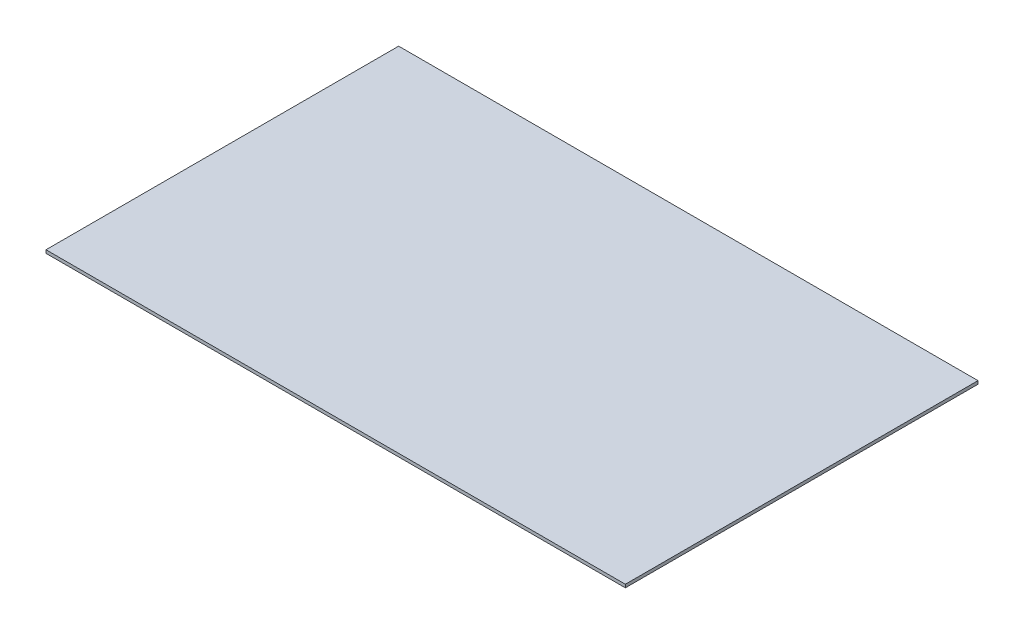
ISO-10303-21;
HEADER;
FILE_DESCRIPTION(('STEP AP214'),'2;1');
FILE_NAME('part.step','',(''),(''),'','','');
FILE_SCHEMA(('AUTOMOTIVE_DESIGN { 1 0 10303 214 1 1 1 1 }'));
ENDSEC;
DATA;
#1=APPLICATION_CONTEXT('core data for automotive mechanical design processes');
#2=APPLICATION_PROTOCOL_DEFINITION('international standard','automotive_design',2000,#1);
#3=PRODUCT_CONTEXT('',#1,'mechanical');
#4=PRODUCT('Part','Part','',(#3));
#5=PRODUCT_RELATED_PRODUCT_CATEGORY('part','',(#4));
#6=PRODUCT_DEFINITION_FORMATION('','',#4);
#7=PRODUCT_DEFINITION_CONTEXT('part definition',#1,'design');
#8=PRODUCT_DEFINITION('design','',#6,#7);
#9=PRODUCT_DEFINITION_SHAPE('','',#8);
#10=(LENGTH_UNIT() NAMED_UNIT(*) SI_UNIT(.MILLI.,.METRE.));
#11=(NAMED_UNIT(*) PLANE_ANGLE_UNIT() SI_UNIT($,.RADIAN.));
#12=(NAMED_UNIT(*) SI_UNIT($,.STERADIAN.) SOLID_ANGLE_UNIT());
#13=UNCERTAINTY_MEASURE_WITH_UNIT(LENGTH_MEASURE(1.E-05),#10,'distance_accuracy_value','');
#14=(GEOMETRIC_REPRESENTATION_CONTEXT(3) GLOBAL_UNCERTAINTY_ASSIGNED_CONTEXT((#13)) GLOBAL_UNIT_ASSIGNED_CONTEXT((#10,
#11,#12)) REPRESENTATION_CONTEXT('',''));
#15=CARTESIAN_POINT('',(0.,0.,0.));
#16=DIRECTION('',(0.,0.,1.));
#17=DIRECTION('',(1.,0.,0.));
#18=AXIS2_PLACEMENT_3D('',#15,#16,#17);
#19=CARTESIAN_POINT('',(0.,3.175,0.));
#20=DIRECTION('',(1.,0.,0.));
#21=DIRECTION('',(0.,0.,-1.));
#22=AXIS2_PLACEMENT_3D('',#19,#20,#21);
#23=PLANE('',#22);
#24=DIRECTION('',(0.,0.,1.));
#25=VECTOR('',#24,1.);
#26=CARTESIAN_POINT('',(0.,0.,0.));
#27=LINE('',#26,#25);
#28=CARTESIAN_POINT('',(0.,0.,-355.6));
#29=VERTEX_POINT('',#28);
#30=CARTESIAN_POINT('',(0.,0.,0.));
#31=VERTEX_POINT('',#30);
#32=EDGE_CURVE('E96',#29,#31,#27,.T.);
#33=ORIENTED_EDGE('',*,*,#32,.T.);
#34=DIRECTION('',(0.,-1.,0.));
#35=VECTOR('',#34,1.);
#36=CARTESIAN_POINT('',(0.,3.175,0.));
#37=LINE('',#36,#35);
#38=CARTESIAN_POINT('',(0.,3.175,0.));
#39=VERTEX_POINT('',#38);
#40=EDGE_CURVE('E11',#39,#31,#37,.T.);
#41=ORIENTED_EDGE('',*,*,#40,.F.);
#42=DIRECTION('',(0.,0.,1.));
#43=VECTOR('',#42,1.);
#44=CARTESIAN_POINT('',(0.,3.175,0.));
#45=LINE('',#44,#43);
#46=CARTESIAN_POINT('',(0.,3.175,-355.6));
#47=VERTEX_POINT('',#46);
#48=EDGE_CURVE('E84',#47,#39,#45,.T.);
#49=ORIENTED_EDGE('',*,*,#48,.F.);
#50=DIRECTION('',(0.,-1.,0.));
#51=VECTOR('',#50,1.);
#52=CARTESIAN_POINT('',(0.,3.175,-355.6));
#53=LINE('',#52,#51);
#54=EDGE_CURVE('E92',#47,#29,#53,.T.);
#55=ORIENTED_EDGE('',*,*,#54,.T.);
#56=EDGE_LOOP('',(#33,#41,#49,#55));
#57=FACE_BOUND('',#56,.T.);
#58=ADVANCED_FACE('F33',(#57),#23,.F.);
#59=CARTESIAN_POINT('',(0.,3.175,0.));
#60=DIRECTION('',(0.,0.,-1.));
#61=DIRECTION('',(-1.,0.,0.));
#62=AXIS2_PLACEMENT_3D('',#59,#60,#61);
#63=PLANE('',#62);
#64=DIRECTION('',(1.,0.,0.));
#65=VECTOR('',#64,1.);
#66=CARTESIAN_POINT('',(0.,0.,0.));
#67=LINE('',#66,#65);
#68=CARTESIAN_POINT('',(584.2,0.,0.));
#69=VERTEX_POINT('',#68);
#70=EDGE_CURVE('E88',#31,#69,#67,.T.);
#71=ORIENTED_EDGE('',*,*,#70,.T.);
#72=DIRECTION('',(0.,-1.,0.));
#73=VECTOR('',#72,1.);
#74=CARTESIAN_POINT('',(584.2,3.175,0.));
#75=LINE('',#74,#73);
#76=CARTESIAN_POINT('',(584.2,3.175,0.));
#77=VERTEX_POINT('',#76);
#78=EDGE_CURVE('E41',#77,#69,#75,.T.);
#79=ORIENTED_EDGE('',*,*,#78,.F.);
#80=DIRECTION('',(1.,0.,0.));
#81=VECTOR('',#80,1.);
#82=CARTESIAN_POINT('',(0.,3.175,0.));
#83=LINE('',#82,#81);
#84=EDGE_CURVE('E79',#39,#77,#83,.T.);
#85=ORIENTED_EDGE('',*,*,#84,.F.);
#86=ORIENTED_EDGE('',*,*,#40,.T.);
#87=EDGE_LOOP('',(#71,#79,#85,#86));
#88=FACE_BOUND('',#87,.T.);
#89=ADVANCED_FACE('F87',(#88),#63,.F.);
#90=CARTESIAN_POINT('',(584.2,3.175,0.));
#91=DIRECTION('',(-1.,0.,0.));
#92=DIRECTION('',(0.,0.,1.));
#93=AXIS2_PLACEMENT_3D('',#90,#91,#92);
#94=PLANE('',#93);
#95=DIRECTION('',(0.,0.,-1.));
#96=VECTOR('',#95,1.);
#97=CARTESIAN_POINT('',(584.2,0.,0.));
#98=LINE('',#97,#96);
#99=CARTESIAN_POINT('',(584.2,0.,-355.6));
#100=VERTEX_POINT('',#99);
#101=EDGE_CURVE('E66',#69,#100,#98,.T.);
#102=ORIENTED_EDGE('',*,*,#101,.T.);
#103=DIRECTION('',(0.,-1.,0.));
#104=VECTOR('',#103,1.);
#105=CARTESIAN_POINT('',(584.2,3.175,-355.6));
#106=LINE('',#105,#104);
#107=CARTESIAN_POINT('',(584.2,3.175,-355.6));
#108=VERTEX_POINT('',#107);
#109=EDGE_CURVE('E89',#108,#100,#106,.T.);
#110=ORIENTED_EDGE('',*,*,#109,.F.);
#111=DIRECTION('',(0.,0.,-1.));
#112=VECTOR('',#111,1.);
#113=CARTESIAN_POINT('',(584.2,3.175,0.));
#114=LINE('',#113,#112);
#115=EDGE_CURVE('E82',#77,#108,#114,.T.);
#116=ORIENTED_EDGE('',*,*,#115,.F.);
#117=ORIENTED_EDGE('',*,*,#78,.T.);
#118=EDGE_LOOP('',(#102,#110,#116,#117));
#119=FACE_BOUND('',#118,.T.);
#120=ADVANCED_FACE('F90',(#119),#94,.F.);
#121=CARTESIAN_POINT('',(0.,3.175,-355.6));
#122=DIRECTION('',(0.,0.,1.));
#123=DIRECTION('',(1.,0.,0.));
#124=AXIS2_PLACEMENT_3D('',#121,#122,#123);
#125=PLANE('',#124);
#126=DIRECTION('',(-1.,0.,0.));
#127=VECTOR('',#126,1.);
#128=CARTESIAN_POINT('',(0.,0.,-355.6));
#129=LINE('',#128,#127);
#130=EDGE_CURVE('E72',#100,#29,#129,.T.);
#131=ORIENTED_EDGE('',*,*,#130,.T.);
#132=ORIENTED_EDGE('',*,*,#54,.F.);
#133=DIRECTION('',(-1.,0.,0.));
#134=VECTOR('',#133,1.);
#135=CARTESIAN_POINT('',(0.,3.175,-355.6));
#136=LINE('',#135,#134);
#137=EDGE_CURVE('E49',#108,#47,#136,.T.);
#138=ORIENTED_EDGE('',*,*,#137,.F.);
#139=ORIENTED_EDGE('',*,*,#109,.T.);
#140=EDGE_LOOP('',(#131,#132,#138,#139));
#141=FACE_BOUND('',#140,.T.);
#142=ADVANCED_FACE('F103',(#141),#125,.F.);
#143=CARTESIAN_POINT('',(0.,3.175,0.));
#144=DIRECTION('',(0.,-1.,0.));
#145=DIRECTION('',(0.,0.,-1.));
#146=AXIS2_PLACEMENT_3D('',#143,#144,#145);
#147=PLANE('',#146);
#148=ORIENTED_EDGE('',*,*,#48,.T.);
#149=ORIENTED_EDGE('',*,*,#84,.T.);
#150=ORIENTED_EDGE('',*,*,#115,.T.);
#151=ORIENTED_EDGE('',*,*,#137,.T.);
#152=EDGE_LOOP('',(#148,#149,#150,#151));
#153=FACE_BOUND('',#152,.T.);
#154=ADVANCED_FACE('F80',(#153),#147,.F.);
#155=CARTESIAN_POINT('',(0.,0.,0.));
#156=DIRECTION('',(0.,-1.,0.));
#157=DIRECTION('',(0.,0.,-1.));
#158=AXIS2_PLACEMENT_3D('',#155,#156,#157);
#159=PLANE('',#158);
#160=ORIENTED_EDGE('',*,*,#32,.F.);
#161=ORIENTED_EDGE('',*,*,#130,.F.);
#162=ORIENTED_EDGE('',*,*,#101,.F.);
#163=ORIENTED_EDGE('',*,*,#70,.F.);
#164=EDGE_LOOP('',(#160,#161,#162,#163));
#165=FACE_BOUND('',#164,.T.);
#166=ADVANCED_FACE('F106',(#165),#159,.T.);
#167=CLOSED_SHELL('',(#58,#89,#120,#142,#154,#166));
#168=MANIFOLD_SOLID_BREP('B2',#167);
#169=ADVANCED_BREP_SHAPE_REPRESENTATION('',(#18,#168),#14);
#170=SHAPE_DEFINITION_REPRESENTATION(#9,#169);
ENDSEC;
END-ISO-10303-21;
